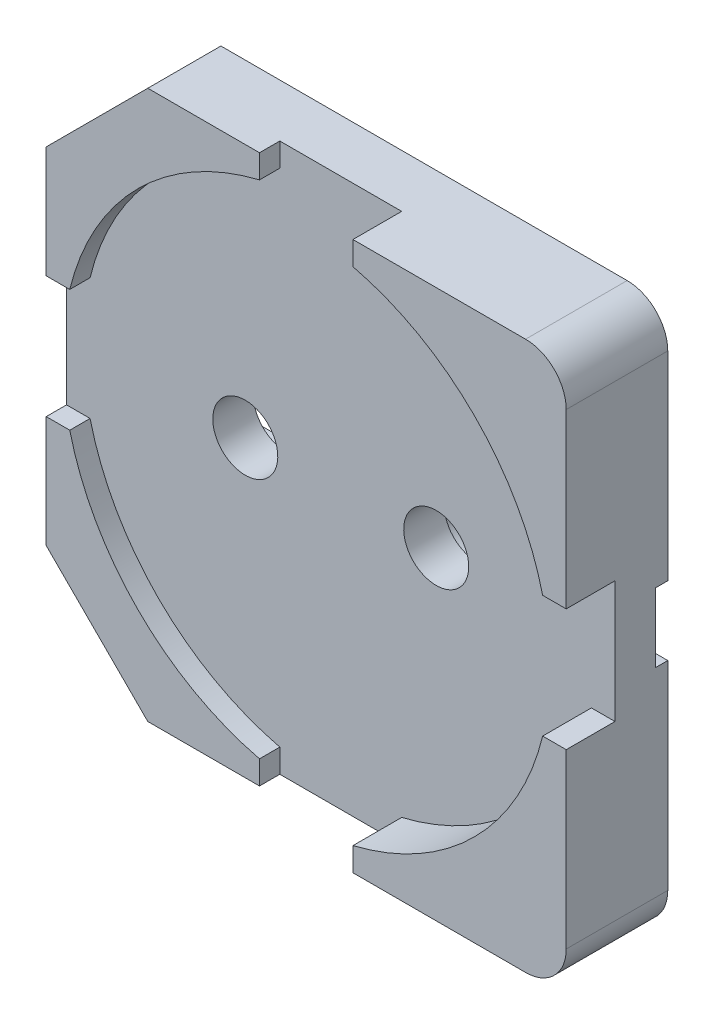
ISO-10303-21;
HEADER;
FILE_DESCRIPTION(('STEP AP214'),'2;1');
FILE_NAME('part.step','',(''),(''),'','','');
FILE_SCHEMA(('AUTOMOTIVE_DESIGN { 1 0 10303 214 1 1 1 1 }'));
ENDSEC;
DATA;
#1=APPLICATION_CONTEXT('core data for automotive mechanical design processes');
#2=APPLICATION_PROTOCOL_DEFINITION('international standard','automotive_design',2000,#1);
#3=PRODUCT_CONTEXT('',#1,'mechanical');
#4=PRODUCT('Part','Part','',(#3));
#5=PRODUCT_RELATED_PRODUCT_CATEGORY('part','',(#4));
#6=PRODUCT_DEFINITION_FORMATION('','',#4);
#7=PRODUCT_DEFINITION_CONTEXT('part definition',#1,'design');
#8=PRODUCT_DEFINITION('design','',#6,#7);
#9=PRODUCT_DEFINITION_SHAPE('','',#8);
#10=(LENGTH_UNIT() NAMED_UNIT(*) SI_UNIT(.MILLI.,.METRE.));
#11=(NAMED_UNIT(*) PLANE_ANGLE_UNIT() SI_UNIT($,.RADIAN.));
#12=(NAMED_UNIT(*) SI_UNIT($,.STERADIAN.) SOLID_ANGLE_UNIT());
#13=UNCERTAINTY_MEASURE_WITH_UNIT(LENGTH_MEASURE(1.E-05),#10,'distance_accuracy_value','');
#14=(GEOMETRIC_REPRESENTATION_CONTEXT(3) GLOBAL_UNCERTAINTY_ASSIGNED_CONTEXT((#13)) GLOBAL_UNIT_ASSIGNED_CONTEXT((#10,
#11,#12)) REPRESENTATION_CONTEXT('',''));
#15=CARTESIAN_POINT('',(0.,0.,0.));
#16=DIRECTION('',(0.,0.,1.));
#17=DIRECTION('',(1.,0.,0.));
#18=AXIS2_PLACEMENT_3D('',#15,#16,#17);
#19=CARTESIAN_POINT('',(0.,0.,0.));
#20=DIRECTION('',(0.,0.,-1.));
#21=DIRECTION('',(-1.,0.,0.));
#22=AXIS2_PLACEMENT_3D('',#19,#20,#21);
#23=PLANE('',#22);
#24=CARTESIAN_POINT('',(2.35,0.,0.));
#25=DIRECTION('',(0.,0.,1.));
#26=DIRECTION('',(0.,-1.,0.));
#27=AXIS2_PLACEMENT_3D('',#24,#25,#26);
#28=CIRCLE('',#27,0.85);
#29=CARTESIAN_POINT('',(2.35,0.85,0.));
#30=VERTEX_POINT('',#29);
#31=CARTESIAN_POINT('',(2.35,-0.85,0.));
#32=VERTEX_POINT('',#31);
#33=EDGE_CURVE('E28',#30,#32,#28,.T.);
#34=ORIENTED_EDGE('',*,*,#33,.T.);
#35=DIRECTION('',(1.,0.,0.));
#36=VECTOR('',#35,1.);
#37=CARTESIAN_POINT('',(0.,-0.85,0.));
#38=LINE('',#37,#36);
#39=CARTESIAN_POINT('',(6.75,-0.85,0.));
#40=VERTEX_POINT('',#39);
#41=EDGE_CURVE('E11',#32,#40,#38,.T.);
#42=ORIENTED_EDGE('',*,*,#41,.T.);
#43=DIRECTION('',(0.,-1.,0.));
#44=VECTOR('',#43,1.);
#45=CARTESIAN_POINT('',(6.75,0.,0.));
#46=LINE('',#45,#44);
#47=CARTESIAN_POINT('',(6.75,-5.75,0.));
#48=VERTEX_POINT('',#47);
#49=EDGE_CURVE('E358',#40,#48,#46,.T.);
#50=ORIENTED_EDGE('',*,*,#49,.T.);
#51=CARTESIAN_POINT('',(5.75,-5.75,0.));
#52=DIRECTION('',(0.,0.,1.));
#53=DIRECTION('',(0.,-1.,0.));
#54=AXIS2_PLACEMENT_3D('',#51,#52,#53);
#55=CIRCLE('',#54,1.);
#56=CARTESIAN_POINT('',(5.75,-6.75,0.));
#57=VERTEX_POINT('',#56);
#58=EDGE_CURVE('E393',#57,#48,#55,.T.);
#59=ORIENTED_EDGE('',*,*,#58,.F.);
#60=DIRECTION('',(-1.,0.,0.));
#61=VECTOR('',#60,1.);
#62=CARTESIAN_POINT('',(0.,-6.75,0.));
#63=LINE('',#62,#61);
#64=CARTESIAN_POINT('',(-4.25,-6.75,0.));
#65=VERTEX_POINT('',#64);
#66=EDGE_CURVE('E351',#57,#65,#63,.T.);
#67=ORIENTED_EDGE('',*,*,#66,.T.);
#68=DIRECTION('',(-0.707106781186548,0.707106781186548,0.));
#69=VECTOR('',#68,1.);
#70=CARTESIAN_POINT('',(-4.25,-6.75,0.));
#71=LINE('',#70,#69);
#72=CARTESIAN_POINT('',(-6.75,-4.25,0.));
#73=VERTEX_POINT('',#72);
#74=EDGE_CURVE('E357',#65,#73,#71,.T.);
#75=ORIENTED_EDGE('',*,*,#74,.T.);
#76=DIRECTION('',(0.,1.,0.));
#77=VECTOR('',#76,1.);
#78=CARTESIAN_POINT('',(-6.75,0.,0.));
#79=LINE('',#78,#77);
#80=CARTESIAN_POINT('',(-6.75,-0.85,0.));
#81=VERTEX_POINT('',#80);
#82=EDGE_CURVE('E386',#73,#81,#79,.T.);
#83=ORIENTED_EDGE('',*,*,#82,.T.);
#84=DIRECTION('',(1.,0.,0.));
#85=VECTOR('',#84,1.);
#86=CARTESIAN_POINT('',(0.,-0.85,0.));
#87=LINE('',#86,#85);
#88=CARTESIAN_POINT('',(-2.35,-0.85,0.));
#89=VERTEX_POINT('',#88);
#90=EDGE_CURVE('E356',#81,#89,#87,.T.);
#91=ORIENTED_EDGE('',*,*,#90,.T.);
#92=CARTESIAN_POINT('',(-2.35,0.,0.));
#93=DIRECTION('',(0.,0.,1.));
#94=DIRECTION('',(0.,-1.,0.));
#95=AXIS2_PLACEMENT_3D('',#92,#93,#94);
#96=CIRCLE('',#95,0.85);
#97=CARTESIAN_POINT('',(-2.35,0.85,0.));
#98=VERTEX_POINT('',#97);
#99=EDGE_CURVE('E385',#89,#98,#96,.T.);
#100=ORIENTED_EDGE('',*,*,#99,.T.);
#101=DIRECTION('',(-1.,0.,0.));
#102=VECTOR('',#101,1.);
#103=CARTESIAN_POINT('',(0.,0.85,0.));
#104=LINE('',#103,#102);
#105=CARTESIAN_POINT('',(-6.75,0.85,0.));
#106=VERTEX_POINT('',#105);
#107=EDGE_CURVE('E592',#98,#106,#104,.T.);
#108=ORIENTED_EDGE('',*,*,#107,.T.);
#109=DIRECTION('',(0.,1.,0.));
#110=VECTOR('',#109,1.);
#111=CARTESIAN_POINT('',(-6.75,0.,0.));
#112=LINE('',#111,#110);
#113=CARTESIAN_POINT('',(-6.75,4.25,0.));
#114=VERTEX_POINT('',#113);
#115=EDGE_CURVE('E389',#106,#114,#112,.T.);
#116=ORIENTED_EDGE('',*,*,#115,.T.);
#117=DIRECTION('',(0.707106781186548,0.707106781186548,0.));
#118=VECTOR('',#117,1.);
#119=CARTESIAN_POINT('',(-6.75,4.25,0.));
#120=LINE('',#119,#118);
#121=CARTESIAN_POINT('',(-4.25,6.75,0.));
#122=VERTEX_POINT('',#121);
#123=EDGE_CURVE('E432',#114,#122,#120,.T.);
#124=ORIENTED_EDGE('',*,*,#123,.T.);
#125=DIRECTION('',(1.,0.,0.));
#126=VECTOR('',#125,1.);
#127=CARTESIAN_POINT('',(0.,6.75,0.));
#128=LINE('',#127,#126);
#129=CARTESIAN_POINT('',(5.75,6.75,0.));
#130=VERTEX_POINT('',#129);
#131=EDGE_CURVE('E130',#122,#130,#128,.T.);
#132=ORIENTED_EDGE('',*,*,#131,.T.);
#133=CARTESIAN_POINT('',(5.75,5.75,0.));
#134=DIRECTION('',(0.,0.,1.));
#135=DIRECTION('',(0.,-1.,0.));
#136=AXIS2_PLACEMENT_3D('',#133,#134,#135);
#137=CIRCLE('',#136,1.);
#138=CARTESIAN_POINT('',(6.75,5.75,0.));
#139=VERTEX_POINT('',#138);
#140=EDGE_CURVE('E501',#139,#130,#137,.T.);
#141=ORIENTED_EDGE('',*,*,#140,.F.);
#142=DIRECTION('',(0.,-1.,0.));
#143=VECTOR('',#142,1.);
#144=CARTESIAN_POINT('',(6.75,0.,0.));
#145=LINE('',#144,#143);
#146=CARTESIAN_POINT('',(6.75,0.85,0.));
#147=VERTEX_POINT('',#146);
#148=EDGE_CURVE('E497',#139,#147,#145,.T.);
#149=ORIENTED_EDGE('',*,*,#148,.T.);
#150=DIRECTION('',(-1.,0.,0.));
#151=VECTOR('',#150,1.);
#152=CARTESIAN_POINT('',(0.,0.85,0.));
#153=LINE('',#152,#151);
#154=EDGE_CURVE('E507',#147,#30,#153,.T.);
#155=ORIENTED_EDGE('',*,*,#154,.T.);
#156=EDGE_LOOP('',(#34,#42,#50,#59,#67,#75,#83,#91,#100,#108,#116,#124,#132,#141,#149,#155));
#157=FACE_BOUND('',#156,.T.);
#158=ADVANCED_FACE('F17',(#157),#23,.T.);
#159=CARTESIAN_POINT('',(6.75,-0.85,0.3));
#160=DIRECTION('',(0.,-1.,0.));
#161=DIRECTION('',(0.,0.,-1.));
#162=AXIS2_PLACEMENT_3D('',#159,#160,#161);
#163=PLANE('',#162);
#164=DIRECTION('',(0.,0.,-1.));
#165=VECTOR('',#164,1.);
#166=CARTESIAN_POINT('',(2.35,-0.85,0.3));
#167=LINE('',#166,#165);
#168=CARTESIAN_POINT('',(2.35,-0.85,0.3));
#169=VERTEX_POINT('',#168);
#170=EDGE_CURVE('E396',#169,#32,#167,.T.);
#171=ORIENTED_EDGE('',*,*,#170,.F.);
#172=DIRECTION('',(-1.,0.,0.));
#173=VECTOR('',#172,1.);
#174=CARTESIAN_POINT('',(6.75,-0.85,0.3));
#175=LINE('',#174,#173);
#176=CARTESIAN_POINT('',(6.75,-0.85,0.3));
#177=VERTEX_POINT('',#176);
#178=EDGE_CURVE('E536',#177,#169,#175,.T.);
#179=ORIENTED_EDGE('',*,*,#178,.F.);
#180=DIRECTION('',(0.,0.,1.));
#181=VECTOR('',#180,1.);
#182=CARTESIAN_POINT('',(6.75,-0.85,0.3));
#183=LINE('',#182,#181);
#184=EDGE_CURVE('E360',#40,#177,#183,.T.);
#185=ORIENTED_EDGE('',*,*,#184,.F.);
#186=ORIENTED_EDGE('',*,*,#41,.F.);
#187=EDGE_LOOP('',(#171,#179,#185,#186));
#188=FACE_BOUND('',#187,.T.);
#189=ADVANCED_FACE('F784',(#188),#163,.F.);
#190=CARTESIAN_POINT('',(2.35,0.,0.3));
#191=DIRECTION('',(0.,0.,-1.));
#192=DIRECTION('',(0.,-1.,0.));
#193=AXIS2_PLACEMENT_3D('',#190,#191,#192);
#194=CYLINDRICAL_SURFACE('',#193,0.85);
#195=DIRECTION('',(0.,0.,-1.));
#196=VECTOR('',#195,1.);
#197=CARTESIAN_POINT('',(2.35,0.85,0.3));
#198=LINE('',#197,#196);
#199=CARTESIAN_POINT('',(2.35,0.85,0.3));
#200=VERTEX_POINT('',#199);
#201=EDGE_CURVE('E513',#200,#30,#198,.T.);
#202=ORIENTED_EDGE('',*,*,#201,.F.);
#203=CARTESIAN_POINT('',(2.35,0.,0.3));
#204=DIRECTION('',(0.,0.,-1.));
#205=DIRECTION('',(0.,-1.,0.));
#206=AXIS2_PLACEMENT_3D('',#203,#204,#205);
#207=CIRCLE('',#206,0.85);
#208=EDGE_CURVE('E323',#169,#200,#207,.T.);
#209=ORIENTED_EDGE('',*,*,#208,.F.);
#210=ORIENTED_EDGE('',*,*,#170,.T.);
#211=ORIENTED_EDGE('',*,*,#33,.F.);
#212=EDGE_LOOP('',(#202,#209,#210,#211));
#213=FACE_BOUND('',#212,.T.);
#214=ADVANCED_FACE('F790',(#213),#194,.F.);
#215=CARTESIAN_POINT('',(6.75,0.85,0.3));
#216=DIRECTION('',(0.,1.,0.));
#217=DIRECTION('',(1.,0.,0.));
#218=AXIS2_PLACEMENT_3D('',#215,#216,#217);
#219=PLANE('',#218);
#220=DIRECTION('',(0.,0.,-1.));
#221=VECTOR('',#220,1.);
#222=CARTESIAN_POINT('',(6.75,0.85,0.3));
#223=LINE('',#222,#221);
#224=CARTESIAN_POINT('',(6.75,0.85,0.3));
#225=VERTEX_POINT('',#224);
#226=EDGE_CURVE('E493',#225,#147,#223,.T.);
#227=ORIENTED_EDGE('',*,*,#226,.F.);
#228=DIRECTION('',(1.,0.,0.));
#229=VECTOR('',#228,1.);
#230=CARTESIAN_POINT('',(6.75,0.85,0.3));
#231=LINE('',#230,#229);
#232=EDGE_CURVE('E588',#200,#225,#231,.T.);
#233=ORIENTED_EDGE('',*,*,#232,.F.);
#234=ORIENTED_EDGE('',*,*,#201,.T.);
#235=ORIENTED_EDGE('',*,*,#154,.F.);
#236=EDGE_LOOP('',(#227,#233,#234,#235));
#237=FACE_BOUND('',#236,.T.);
#238=ADVANCED_FACE('F754',(#237),#219,.F.);
#239=CARTESIAN_POINT('',(6.75,6.75,1.3));
#240=DIRECTION('',(-1.,0.,0.));
#241=DIRECTION('',(0.,1.,0.));
#242=AXIS2_PLACEMENT_3D('',#239,#240,#241);
#243=PLANE('',#242);
#244=DIRECTION('',(0.,0.,1.));
#245=VECTOR('',#244,1.);
#246=CARTESIAN_POINT('',(6.75,-5.75,1.3));
#247=LINE('',#246,#245);
#248=CARTESIAN_POINT('',(6.75,-5.75,2.5));
#249=VERTEX_POINT('',#248);
#250=EDGE_CURVE('E390',#48,#249,#247,.T.);
#251=ORIENTED_EDGE('',*,*,#250,.F.);
#252=ORIENTED_EDGE('',*,*,#49,.F.);
#253=ORIENTED_EDGE('',*,*,#184,.T.);
#254=DIRECTION('',(0.,-1.,0.));
#255=VECTOR('',#254,1.);
#256=CARTESIAN_POINT('',(6.75,6.75,0.3));
#257=LINE('',#256,#255);
#258=EDGE_CURVE('E544',#225,#177,#257,.T.);
#259=ORIENTED_EDGE('',*,*,#258,.F.);
#260=ORIENTED_EDGE('',*,*,#226,.T.);
#261=ORIENTED_EDGE('',*,*,#148,.F.);
#262=DIRECTION('',(0.,0.,-1.));
#263=VECTOR('',#262,1.);
#264=CARTESIAN_POINT('',(6.75,5.75,1.3));
#265=LINE('',#264,#263);
#266=CARTESIAN_POINT('',(6.75,5.75,2.5));
#267=VERTEX_POINT('',#266);
#268=EDGE_CURVE('E468',#267,#139,#265,.T.);
#269=ORIENTED_EDGE('',*,*,#268,.F.);
#270=DIRECTION('',(0.,1.,0.));
#271=VECTOR('',#270,1.);
#272=CARTESIAN_POINT('',(6.75,6.75,2.5));
#273=LINE('',#272,#271);
#274=CARTESIAN_POINT('',(6.75,1.5,2.5));
#275=VERTEX_POINT('',#274);
#276=EDGE_CURVE('E409',#275,#267,#273,.T.);
#277=ORIENTED_EDGE('',*,*,#276,.F.);
#278=DIRECTION('',(0.,0.,1.));
#279=VECTOR('',#278,1.);
#280=CARTESIAN_POINT('',(6.75,1.5,1.3));
#281=LINE('',#280,#279);
#282=CARTESIAN_POINT('',(6.75,1.5,1.3));
#283=VERTEX_POINT('',#282);
#284=EDGE_CURVE('E551',#283,#275,#281,.T.);
#285=ORIENTED_EDGE('',*,*,#284,.F.);
#286=DIRECTION('',(0.,1.,0.));
#287=VECTOR('',#286,1.);
#288=CARTESIAN_POINT('',(6.75,6.75,1.3));
#289=LINE('',#288,#287);
#290=CARTESIAN_POINT('',(6.75,-1.5,1.3));
#291=VERTEX_POINT('',#290);
#292=EDGE_CURVE('E330',#291,#283,#289,.T.);
#293=ORIENTED_EDGE('',*,*,#292,.F.);
#294=DIRECTION('',(0.,0.,-1.));
#295=VECTOR('',#294,1.);
#296=CARTESIAN_POINT('',(6.75,-1.5,1.3));
#297=LINE('',#296,#295);
#298=CARTESIAN_POINT('',(6.75,-1.5,2.5));
#299=VERTEX_POINT('',#298);
#300=EDGE_CURVE('E327',#299,#291,#297,.T.);
#301=ORIENTED_EDGE('',*,*,#300,.F.);
#302=DIRECTION('',(0.,1.,0.));
#303=VECTOR('',#302,1.);
#304=CARTESIAN_POINT('',(6.75,6.75,2.5));
#305=LINE('',#304,#303);
#306=EDGE_CURVE('E311',#249,#299,#305,.T.);
#307=ORIENTED_EDGE('',*,*,#306,.F.);
#308=EDGE_LOOP('',(#251,#252,#253,#259,#260,#261,#269,#277,#285,#293,#301,#307));
#309=FACE_BOUND('',#308,.T.);
#310=ADVANCED_FACE('F328',(#309),#243,.F.);
#311=CARTESIAN_POINT('',(6.75,6.75,1.3));
#312=DIRECTION('',(0.,-1.,0.));
#313=DIRECTION('',(0.,0.,-1.));
#314=AXIS2_PLACEMENT_3D('',#311,#312,#313);
#315=PLANE('',#314);
#316=DIRECTION('',(0.,0.,1.));
#317=VECTOR('',#316,1.);
#318=CARTESIAN_POINT('',(5.75,6.75,1.3));
#319=LINE('',#318,#317);
#320=CARTESIAN_POINT('',(5.75,6.75,2.5));
#321=VERTEX_POINT('',#320);
#322=EDGE_CURVE('E472',#130,#321,#319,.T.);
#323=ORIENTED_EDGE('',*,*,#322,.F.);
#324=ORIENTED_EDGE('',*,*,#131,.F.);
#325=DIRECTION('',(0.,0.,-1.));
#326=VECTOR('',#325,1.);
#327=CARTESIAN_POINT('',(-4.25,6.75,1.3));
#328=LINE('',#327,#326);
#329=CARTESIAN_POINT('',(-4.25,6.75,1.8));
#330=VERTEX_POINT('',#329);
#331=EDGE_CURVE('E388',#330,#122,#328,.T.);
#332=ORIENTED_EDGE('',*,*,#331,.F.);
#333=DIRECTION('',(-1.,0.,0.));
#334=VECTOR('',#333,1.);
#335=CARTESIAN_POINT('',(6.75,6.75,1.8));
#336=LINE('',#335,#334);
#337=CARTESIAN_POINT('',(-1.5,6.75,1.8));
#338=VERTEX_POINT('',#337);
#339=EDGE_CURVE('E347',#338,#330,#336,.T.);
#340=ORIENTED_EDGE('',*,*,#339,.F.);
#341=DIRECTION('',(0.,0.,1.));
#342=VECTOR('',#341,1.);
#343=CARTESIAN_POINT('',(-1.5,6.75,1.3));
#344=LINE('',#343,#342);
#345=CARTESIAN_POINT('',(-1.5,6.75,1.3));
#346=VERTEX_POINT('',#345);
#347=EDGE_CURVE('E558',#346,#338,#344,.T.);
#348=ORIENTED_EDGE('',*,*,#347,.F.);
#349=DIRECTION('',(-1.,0.,0.));
#350=VECTOR('',#349,1.);
#351=CARTESIAN_POINT('',(6.75,6.75,1.3));
#352=LINE('',#351,#350);
#353=CARTESIAN_POINT('',(1.5,6.75,1.3));
#354=VERTEX_POINT('',#353);
#355=EDGE_CURVE('E512',#354,#346,#352,.T.);
#356=ORIENTED_EDGE('',*,*,#355,.F.);
#357=DIRECTION('',(0.,0.,-1.));
#358=VECTOR('',#357,1.);
#359=CARTESIAN_POINT('',(1.5,6.75,1.3));
#360=LINE('',#359,#358);
#361=CARTESIAN_POINT('',(1.5,6.75,2.5));
#362=VERTEX_POINT('',#361);
#363=EDGE_CURVE('E433',#362,#354,#360,.T.);
#364=ORIENTED_EDGE('',*,*,#363,.F.);
#365=DIRECTION('',(-1.,0.,0.));
#366=VECTOR('',#365,1.);
#367=CARTESIAN_POINT('',(6.75,6.75,2.5));
#368=LINE('',#367,#366);
#369=EDGE_CURVE('E498',#321,#362,#368,.T.);
#370=ORIENTED_EDGE('',*,*,#369,.F.);
#371=EDGE_LOOP('',(#323,#324,#332,#340,#348,#356,#364,#370));
#372=FACE_BOUND('',#371,.T.);
#373=ADVANCED_FACE('F721',(#372),#315,.F.);
#374=CARTESIAN_POINT('',(-6.75,4.25,1.3));
#375=DIRECTION('',(0.707106781186548,-0.707106781186548,0.));
#376=DIRECTION('',(0.,0.,-1.));
#377=AXIS2_PLACEMENT_3D('',#374,#375,#376);
#378=PLANE('',#377);
#379=ORIENTED_EDGE('',*,*,#331,.T.);
#380=ORIENTED_EDGE('',*,*,#123,.F.);
#381=DIRECTION('',(0.,0.,-1.));
#382=VECTOR('',#381,1.);
#383=CARTESIAN_POINT('',(-6.75,4.25,1.3));
#384=LINE('',#383,#382);
#385=CARTESIAN_POINT('',(-6.75,4.25,1.8));
#386=VERTEX_POINT('',#385);
#387=EDGE_CURVE('E455',#386,#114,#384,.T.);
#388=ORIENTED_EDGE('',*,*,#387,.F.);
#389=DIRECTION('',(-0.707106781186548,-0.707106781186548,0.));
#390=VECTOR('',#389,1.);
#391=CARTESIAN_POINT('',(-6.75,4.25,1.8));
#392=LINE('',#391,#390);
#393=EDGE_CURVE('E476',#330,#386,#392,.T.);
#394=ORIENTED_EDGE('',*,*,#393,.F.);
#395=EDGE_LOOP('',(#379,#380,#388,#394));
#396=FACE_BOUND('',#395,.T.);
#397=ADVANCED_FACE('F19',(#396),#378,.F.);
#398=CARTESIAN_POINT('',(-6.75,6.75,1.3));
#399=DIRECTION('',(1.,0.,0.));
#400=DIRECTION('',(0.,1.,0.));
#401=AXIS2_PLACEMENT_3D('',#398,#399,#400);
#402=PLANE('',#401);
#403=DIRECTION('',(0.,0.,-1.));
#404=VECTOR('',#403,1.);
#405=CARTESIAN_POINT('',(-6.75,-4.25,1.3));
#406=LINE('',#405,#404);
#407=CARTESIAN_POINT('',(-6.75,-4.25,1.8));
#408=VERTEX_POINT('',#407);
#409=EDGE_CURVE('E523',#408,#73,#406,.T.);
#410=ORIENTED_EDGE('',*,*,#409,.F.);
#411=DIRECTION('',(0.,-1.,0.));
#412=VECTOR('',#411,1.);
#413=CARTESIAN_POINT('',(-6.75,6.75,1.8));
#414=LINE('',#413,#412);
#415=CARTESIAN_POINT('',(-6.75,-1.5,1.8));
#416=VERTEX_POINT('',#415);
#417=EDGE_CURVE('E421',#416,#408,#414,.T.);
#418=ORIENTED_EDGE('',*,*,#417,.F.);
#419=DIRECTION('',(0.,0.,1.));
#420=VECTOR('',#419,1.);
#421=CARTESIAN_POINT('',(-6.75,-1.5,1.3));
#422=LINE('',#421,#420);
#423=CARTESIAN_POINT('',(-6.75,-1.5,1.3));
#424=VERTEX_POINT('',#423);
#425=EDGE_CURVE('E429',#424,#416,#422,.T.);
#426=ORIENTED_EDGE('',*,*,#425,.F.);
#427=DIRECTION('',(0.,-1.,0.));
#428=VECTOR('',#427,1.);
#429=CARTESIAN_POINT('',(-6.75,6.75,1.3));
#430=LINE('',#429,#428);
#431=CARTESIAN_POINT('',(-6.75,1.5,1.3));
#432=VERTEX_POINT('',#431);
#433=EDGE_CURVE('E334',#432,#424,#430,.T.);
#434=ORIENTED_EDGE('',*,*,#433,.F.);
#435=DIRECTION('',(0.,0.,-1.));
#436=VECTOR('',#435,1.);
#437=CARTESIAN_POINT('',(-6.75,1.5,1.3));
#438=LINE('',#437,#436);
#439=CARTESIAN_POINT('',(-6.75,1.5,1.8));
#440=VERTEX_POINT('',#439);
#441=EDGE_CURVE('E403',#440,#432,#438,.T.);
#442=ORIENTED_EDGE('',*,*,#441,.F.);
#443=DIRECTION('',(0.,-1.,0.));
#444=VECTOR('',#443,1.);
#445=CARTESIAN_POINT('',(-6.75,6.75,1.8));
#446=LINE('',#445,#444);
#447=EDGE_CURVE('E473',#386,#440,#446,.T.);
#448=ORIENTED_EDGE('',*,*,#447,.F.);
#449=ORIENTED_EDGE('',*,*,#387,.T.);
#450=ORIENTED_EDGE('',*,*,#115,.F.);
#451=DIRECTION('',(0.,0.,-1.));
#452=VECTOR('',#451,1.);
#453=CARTESIAN_POINT('',(-6.75,0.85,1.3));
#454=LINE('',#453,#452);
#455=CARTESIAN_POINT('',(-6.75,0.85,0.3));
#456=VERTEX_POINT('',#455);
#457=EDGE_CURVE('E605',#456,#106,#454,.T.);
#458=ORIENTED_EDGE('',*,*,#457,.F.);
#459=DIRECTION('',(0.,1.,0.));
#460=VECTOR('',#459,1.);
#461=CARTESIAN_POINT('',(-6.75,0.,0.3));
#462=LINE('',#461,#460);
#463=CARTESIAN_POINT('',(-6.75,-0.85,0.3));
#464=VERTEX_POINT('',#463);
#465=EDGE_CURVE('E373',#464,#456,#462,.T.);
#466=ORIENTED_EDGE('',*,*,#465,.F.);
#467=DIRECTION('',(0.,0.,1.));
#468=VECTOR('',#467,1.);
#469=CARTESIAN_POINT('',(-6.75,-0.85,1.3));
#470=LINE('',#469,#468);
#471=EDGE_CURVE('E438',#81,#464,#470,.T.);
#472=ORIENTED_EDGE('',*,*,#471,.F.);
#473=ORIENTED_EDGE('',*,*,#82,.F.);
#474=EDGE_LOOP('',(#410,#418,#426,#434,#442,#448,#449,#450,#458,#466,#472,#473));
#475=FACE_BOUND('',#474,.T.);
#476=ADVANCED_FACE('F716',(#475),#402,.F.);
#477=CARTESIAN_POINT('',(-6.75,0.85,0.3));
#478=DIRECTION('',(0.,-1.,0.));
#479=DIRECTION('',(0.,0.,-1.));
#480=AXIS2_PLACEMENT_3D('',#477,#478,#479);
#481=PLANE('',#480);
#482=DIRECTION('',(-1.,0.,0.));
#483=VECTOR('',#482,1.);
#484=CARTESIAN_POINT('',(-6.75,0.85,0.3));
#485=LINE('',#484,#483);
#486=CARTESIAN_POINT('',(-2.35,0.85,0.3));
#487=VERTEX_POINT('',#486);
#488=EDGE_CURVE('E480',#487,#456,#485,.T.);
#489=ORIENTED_EDGE('',*,*,#488,.T.);
#490=ORIENTED_EDGE('',*,*,#457,.T.);
#491=ORIENTED_EDGE('',*,*,#107,.F.);
#492=DIRECTION('',(0.,0.,1.));
#493=VECTOR('',#492,1.);
#494=CARTESIAN_POINT('',(-2.35,0.85,0.3));
#495=LINE('',#494,#493);
#496=EDGE_CURVE('E441',#98,#487,#495,.T.);
#497=ORIENTED_EDGE('',*,*,#496,.T.);
#498=EDGE_LOOP('',(#489,#490,#491,#497));
#499=FACE_BOUND('',#498,.T.);
#500=ADVANCED_FACE('F710',(#499),#481,.T.);
#501=CARTESIAN_POINT('',(-2.35,0.,0.3));
#502=DIRECTION('',(0.,0.,-1.));
#503=DIRECTION('',(0.,-1.,0.));
#504=AXIS2_PLACEMENT_3D('',#501,#502,#503);
#505=CYLINDRICAL_SURFACE('',#504,0.85);
#506=DIRECTION('',(0.,0.,-1.));
#507=VECTOR('',#506,1.);
#508=CARTESIAN_POINT('',(-2.35,-0.85,0.3));
#509=LINE('',#508,#507);
#510=CARTESIAN_POINT('',(-2.35,-0.85,0.3));
#511=VERTEX_POINT('',#510);
#512=EDGE_CURVE('E353',#511,#89,#509,.T.);
#513=ORIENTED_EDGE('',*,*,#512,.F.);
#514=CARTESIAN_POINT('',(-2.35,0.,0.3));
#515=DIRECTION('',(0.,0.,-1.));
#516=DIRECTION('',(0.,-1.,0.));
#517=AXIS2_PLACEMENT_3D('',#514,#515,#516);
#518=CIRCLE('',#517,0.85);
#519=EDGE_CURVE('E361',#487,#511,#518,.T.);
#520=ORIENTED_EDGE('',*,*,#519,.F.);
#521=ORIENTED_EDGE('',*,*,#496,.F.);
#522=ORIENTED_EDGE('',*,*,#99,.F.);
#523=EDGE_LOOP('',(#513,#520,#521,#522));
#524=FACE_BOUND('',#523,.T.);
#525=ADVANCED_FACE('F709',(#524),#505,.F.);
#526=CARTESIAN_POINT('',(-6.75,-0.85,0.3));
#527=DIRECTION('',(0.,1.,0.));
#528=DIRECTION('',(1.,0.,0.));
#529=AXIS2_PLACEMENT_3D('',#526,#527,#528);
#530=PLANE('',#529);
#531=DIRECTION('',(1.,0.,0.));
#532=VECTOR('',#531,1.);
#533=CARTESIAN_POINT('',(-6.75,-0.85,0.3));
#534=LINE('',#533,#532);
#535=EDGE_CURVE('E364',#464,#511,#534,.T.);
#536=ORIENTED_EDGE('',*,*,#535,.T.);
#537=ORIENTED_EDGE('',*,*,#512,.T.);
#538=ORIENTED_EDGE('',*,*,#90,.F.);
#539=ORIENTED_EDGE('',*,*,#471,.T.);
#540=EDGE_LOOP('',(#536,#537,#538,#539));
#541=FACE_BOUND('',#540,.T.);
#542=ADVANCED_FACE('F799',(#541),#530,.T.);
#543=CARTESIAN_POINT('',(-4.25,-6.75,1.3));
#544=DIRECTION('',(0.707106781186548,0.707106781186548,0.));
#545=DIRECTION('',(0.,0.,-1.));
#546=AXIS2_PLACEMENT_3D('',#543,#544,#545);
#547=PLANE('',#546);
#548=ORIENTED_EDGE('',*,*,#409,.T.);
#549=ORIENTED_EDGE('',*,*,#74,.F.);
#550=DIRECTION('',(0.,0.,-1.));
#551=VECTOR('',#550,1.);
#552=CARTESIAN_POINT('',(-4.25,-6.75,1.3));
#553=LINE('',#552,#551);
#554=CARTESIAN_POINT('',(-4.25,-6.75,1.8));
#555=VERTEX_POINT('',#554);
#556=EDGE_CURVE('E543',#555,#65,#553,.T.);
#557=ORIENTED_EDGE('',*,*,#556,.F.);
#558=DIRECTION('',(0.707106781186548,-0.707106781186548,0.));
#559=VECTOR('',#558,1.);
#560=CARTESIAN_POINT('',(-4.25,-6.75,1.8));
#561=LINE('',#560,#559);
#562=EDGE_CURVE('E415',#408,#555,#561,.T.);
#563=ORIENTED_EDGE('',*,*,#562,.F.);
#564=EDGE_LOOP('',(#548,#549,#557,#563));
#565=FACE_BOUND('',#564,.T.);
#566=ADVANCED_FACE('F835',(#565),#547,.F.);
#567=CARTESIAN_POINT('',(6.75,-6.75,1.3));
#568=DIRECTION('',(0.,1.,0.));
#569=DIRECTION('',(1.,0.,0.));
#570=AXIS2_PLACEMENT_3D('',#567,#568,#569);
#571=PLANE('',#570);
#572=DIRECTION('',(0.,0.,-1.));
#573=VECTOR('',#572,1.);
#574=CARTESIAN_POINT('',(5.75,-6.75,1.3));
#575=LINE('',#574,#573);
#576=CARTESIAN_POINT('',(5.75,-6.75,2.5));
#577=VERTEX_POINT('',#576);
#578=EDGE_CURVE('E448',#577,#57,#575,.T.);
#579=ORIENTED_EDGE('',*,*,#578,.F.);
#580=DIRECTION('',(1.,0.,0.));
#581=VECTOR('',#580,1.);
#582=CARTESIAN_POINT('',(6.75,-6.75,2.5));
#583=LINE('',#582,#581);
#584=CARTESIAN_POINT('',(1.5,-6.75,2.5));
#585=VERTEX_POINT('',#584);
#586=EDGE_CURVE('E324',#585,#577,#583,.T.);
#587=ORIENTED_EDGE('',*,*,#586,.F.);
#588=DIRECTION('',(0.,0.,1.));
#589=VECTOR('',#588,1.);
#590=CARTESIAN_POINT('',(1.5,-6.75,1.3));
#591=LINE('',#590,#589);
#592=CARTESIAN_POINT('',(1.5,-6.75,1.3));
#593=VERTEX_POINT('',#592);
#594=EDGE_CURVE('E376',#593,#585,#591,.T.);
#595=ORIENTED_EDGE('',*,*,#594,.F.);
#596=DIRECTION('',(1.,0.,0.));
#597=VECTOR('',#596,1.);
#598=CARTESIAN_POINT('',(6.75,-6.75,1.3));
#599=LINE('',#598,#597);
#600=CARTESIAN_POINT('',(-1.5,-6.75,1.3));
#601=VERTEX_POINT('',#600);
#602=EDGE_CURVE('E595',#601,#593,#599,.T.);
#603=ORIENTED_EDGE('',*,*,#602,.F.);
#604=DIRECTION('',(0.,0.,-1.));
#605=VECTOR('',#604,1.);
#606=CARTESIAN_POINT('',(-1.5,-6.75,1.3));
#607=LINE('',#606,#605);
#608=CARTESIAN_POINT('',(-1.5,-6.75,1.8));
#609=VERTEX_POINT('',#608);
#610=EDGE_CURVE('E489',#609,#601,#607,.T.);
#611=ORIENTED_EDGE('',*,*,#610,.F.);
#612=DIRECTION('',(1.,0.,0.));
#613=VECTOR('',#612,1.);
#614=CARTESIAN_POINT('',(6.75,-6.75,1.8));
#615=LINE('',#614,#613);
#616=EDGE_CURVE('E418',#555,#609,#615,.T.);
#617=ORIENTED_EDGE('',*,*,#616,.F.);
#618=ORIENTED_EDGE('',*,*,#556,.T.);
#619=ORIENTED_EDGE('',*,*,#66,.F.);
#620=EDGE_LOOP('',(#579,#587,#595,#603,#611,#617,#618,#619));
#621=FACE_BOUND('',#620,.T.);
#622=ADVANCED_FACE('F832',(#621),#571,.F.);
#623=CARTESIAN_POINT('',(2.35,0.,0.3));
#624=DIRECTION('',(0.,0.,-1.));
#625=DIRECTION('',(-1.,0.,0.));
#626=AXIS2_PLACEMENT_3D('',#623,#624,#625);
#627=PLANE('',#626);
#628=ORIENTED_EDGE('',*,*,#208,.T.);
#629=ORIENTED_EDGE('',*,*,#232,.T.);
#630=ORIENTED_EDGE('',*,*,#258,.T.);
#631=ORIENTED_EDGE('',*,*,#178,.T.);
#632=EDGE_LOOP('',(#628,#629,#630,#631));
#633=FACE_BOUND('',#632,.T.);
#634=CARTESIAN_POINT('',(2.35,0.,0.3));
#635=DIRECTION('',(0.,0.,1.));
#636=DIRECTION('',(0.,1.,0.));
#637=AXIS2_PLACEMENT_3D('',#634,#635,#636);
#638=CIRCLE('',#637,0.8);
#639=CARTESIAN_POINT('',(2.35,0.8,0.3));
#640=VERTEX_POINT('',#639);
#641=EDGE_CURVE('E461',#640,#640,#638,.T.);
#642=ORIENTED_EDGE('',*,*,#641,.T.);
#643=EDGE_LOOP('',(#642));
#644=FACE_BOUND('',#643,.T.);
#645=ADVANCED_FACE('F831',(#633,#644),#627,.T.);
#646=CARTESIAN_POINT('',(0.,0.,2.5));
#647=DIRECTION('',(0.,0.,1.));
#648=DIRECTION('',(0.,-1.,0.));
#649=AXIS2_PLACEMENT_3D('',#646,#647,#648);
#650=PLANE('',#649);
#651=CARTESIAN_POINT('',(0.,0.,2.5));
#652=DIRECTION('',(0.,0.,-1.));
#653=DIRECTION('',(0.,-1.,0.));
#654=AXIS2_PLACEMENT_3D('',#651,#652,#653);
#655=CIRCLE('',#654,6.35);
#656=CARTESIAN_POINT('',(6.170291727301,-1.5,2.5));
#657=VERTEX_POINT('',#656);
#658=CARTESIAN_POINT('',(1.5,-6.170291727301,2.5));
#659=VERTEX_POINT('',#658);
#660=EDGE_CURVE('E535',#657,#659,#655,.T.);
#661=ORIENTED_EDGE('',*,*,#660,.T.);
#662=DIRECTION('',(0.,-1.,0.));
#663=VECTOR('',#662,1.);
#664=CARTESIAN_POINT('',(1.5,0.,2.5));
#665=LINE('',#664,#663);
#666=EDGE_CURVE('E234',#659,#585,#665,.T.);
#667=ORIENTED_EDGE('',*,*,#666,.T.);
#668=ORIENTED_EDGE('',*,*,#586,.T.);
#669=CARTESIAN_POINT('',(5.75,-5.75,2.5));
#670=DIRECTION('',(0.,0.,1.));
#671=DIRECTION('',(0.,-1.,0.));
#672=AXIS2_PLACEMENT_3D('',#669,#670,#671);
#673=CIRCLE('',#672,1.);
#674=EDGE_CURVE('E318',#577,#249,#673,.T.);
#675=ORIENTED_EDGE('',*,*,#674,.T.);
#676=ORIENTED_EDGE('',*,*,#306,.T.);
#677=DIRECTION('',(-1.,0.,0.));
#678=VECTOR('',#677,1.);
#679=CARTESIAN_POINT('',(0.,-1.5,2.5));
#680=LINE('',#679,#678);
#681=EDGE_CURVE('E315',#299,#657,#680,.T.);
#682=ORIENTED_EDGE('',*,*,#681,.T.);
#683=EDGE_LOOP('',(#661,#667,#668,#675,#676,#682));
#684=FACE_BOUND('',#683,.T.);
#685=ADVANCED_FACE('F313',(#684),#650,.T.);
#686=CARTESIAN_POINT('',(5.75,-5.75,1.3));
#687=DIRECTION('',(0.,0.,-1.));
#688=DIRECTION('',(0.,-1.,0.));
#689=AXIS2_PLACEMENT_3D('',#686,#687,#688);
#690=CYLINDRICAL_SURFACE('',#689,1.);
#691=ORIENTED_EDGE('',*,*,#58,.T.);
#692=ORIENTED_EDGE('',*,*,#250,.T.);
#693=ORIENTED_EDGE('',*,*,#674,.F.);
#694=ORIENTED_EDGE('',*,*,#578,.T.);
#695=EDGE_LOOP('',(#691,#692,#693,#694));
#696=FACE_BOUND('',#695,.T.);
#697=ADVANCED_FACE('F830',(#696),#690,.T.);
#698=CARTESIAN_POINT('',(5.75,5.75,1.3));
#699=DIRECTION('',(0.,0.,-1.));
#700=DIRECTION('',(0.,-1.,0.));
#701=AXIS2_PLACEMENT_3D('',#698,#699,#700);
#702=CYLINDRICAL_SURFACE('',#701,1.);
#703=ORIENTED_EDGE('',*,*,#140,.T.);
#704=ORIENTED_EDGE('',*,*,#322,.T.);
#705=CARTESIAN_POINT('',(5.75,5.75,2.5));
#706=DIRECTION('',(0.,0.,-1.));
#707=DIRECTION('',(0.,-1.,0.));
#708=AXIS2_PLACEMENT_3D('',#705,#706,#707);
#709=CIRCLE('',#708,1.);
#710=EDGE_CURVE('E413',#321,#267,#709,.T.);
#711=ORIENTED_EDGE('',*,*,#710,.T.);
#712=ORIENTED_EDGE('',*,*,#268,.T.);
#713=EDGE_LOOP('',(#703,#704,#711,#712));
#714=FACE_BOUND('',#713,.T.);
#715=ADVANCED_FACE('F748',(#714),#702,.T.);
#716=CARTESIAN_POINT('',(0.,0.,2.5));
#717=DIRECTION('',(0.,0.,1.));
#718=DIRECTION('',(0.,-1.,0.));
#719=AXIS2_PLACEMENT_3D('',#716,#717,#718);
#720=PLANE('',#719);
#721=CARTESIAN_POINT('',(0.,0.,2.5));
#722=DIRECTION('',(0.,0.,-1.));
#723=DIRECTION('',(0.,-1.,0.));
#724=AXIS2_PLACEMENT_3D('',#721,#722,#723);
#725=CIRCLE('',#724,6.35);
#726=CARTESIAN_POINT('',(1.5,6.170291727301,2.5));
#727=VERTEX_POINT('',#726);
#728=CARTESIAN_POINT('',(6.170291727301,1.5,2.5));
#729=VERTEX_POINT('',#728);
#730=EDGE_CURVE('E402',#727,#729,#725,.T.);
#731=ORIENTED_EDGE('',*,*,#730,.T.);
#732=DIRECTION('',(1.,0.,0.));
#733=VECTOR('',#732,1.);
#734=CARTESIAN_POINT('',(0.,1.5,2.5));
#735=LINE('',#734,#733);
#736=EDGE_CURVE('E414',#729,#275,#735,.T.);
#737=ORIENTED_EDGE('',*,*,#736,.T.);
#738=ORIENTED_EDGE('',*,*,#276,.T.);
#739=ORIENTED_EDGE('',*,*,#710,.F.);
#740=ORIENTED_EDGE('',*,*,#369,.T.);
#741=DIRECTION('',(0.,-1.,0.));
#742=VECTOR('',#741,1.);
#743=CARTESIAN_POINT('',(1.5,0.,2.5));
#744=LINE('',#743,#742);
#745=EDGE_CURVE('E425',#362,#727,#744,.T.);
#746=ORIENTED_EDGE('',*,*,#745,.T.);
#747=EDGE_LOOP('',(#731,#737,#738,#739,#740,#746));
#748=FACE_BOUND('',#747,.T.);
#749=ADVANCED_FACE('F744',(#748),#720,.T.);
#750=CARTESIAN_POINT('',(6.75,1.5,2.501));
#751=DIRECTION('',(0.,-1.,0.));
#752=DIRECTION('',(0.,0.,-1.));
#753=AXIS2_PLACEMENT_3D('',#750,#751,#752);
#754=PLANE('',#753);
#755=DIRECTION('',(1.,0.,0.));
#756=VECTOR('',#755,1.);
#757=CARTESIAN_POINT('',(6.75,1.5,1.3));
#758=LINE('',#757,#756);
#759=CARTESIAN_POINT('',(6.170291727301,1.5,1.3));
#760=VERTEX_POINT('',#759);
#761=EDGE_CURVE('E508',#760,#283,#758,.T.);
#762=ORIENTED_EDGE('',*,*,#761,.T.);
#763=ORIENTED_EDGE('',*,*,#284,.T.);
#764=ORIENTED_EDGE('',*,*,#736,.F.);
#765=DIRECTION('',(0.,0.,-1.));
#766=VECTOR('',#765,1.);
#767=CARTESIAN_POINT('',(6.170291727301,1.5,2.501));
#768=LINE('',#767,#766);
#769=EDGE_CURVE('E649',#729,#760,#768,.T.);
#770=ORIENTED_EDGE('',*,*,#769,.T.);
#771=EDGE_LOOP('',(#762,#763,#764,#770));
#772=FACE_BOUND('',#771,.T.);
#773=ADVANCED_FACE('F772',(#772),#754,.T.);
#774=CARTESIAN_POINT('',(0.,0.,1.3));
#775=DIRECTION('',(0.,0.,-1.));
#776=DIRECTION('',(-1.,0.,0.));
#777=AXIS2_PLACEMENT_3D('',#774,#775,#776);
#778=PLANE('',#777);
#779=DIRECTION('',(0.,1.,0.));
#780=VECTOR('',#779,1.);
#781=CARTESIAN_POINT('',(-1.5,0.,1.3));
#782=LINE('',#781,#780);
#783=CARTESIAN_POINT('',(-1.5,6.170291727301,1.3));
#784=VERTEX_POINT('',#783);
#785=EDGE_CURVE('E580',#784,#346,#782,.T.);
#786=ORIENTED_EDGE('',*,*,#785,.F.);
#787=CARTESIAN_POINT('',(0.,0.,1.3));
#788=DIRECTION('',(0.,0.,-1.));
#789=DIRECTION('',(0.,-1.,0.));
#790=AXIS2_PLACEMENT_3D('',#787,#788,#789);
#791=CIRCLE('',#790,6.35);
#792=CARTESIAN_POINT('',(-6.170291727301,1.5,1.3));
#793=VERTEX_POINT('',#792);
#794=EDGE_CURVE('E567',#793,#784,#791,.T.);
#795=ORIENTED_EDGE('',*,*,#794,.F.);
#796=DIRECTION('',(1.,0.,0.));
#797=VECTOR('',#796,1.);
#798=CARTESIAN_POINT('',(0.,1.5,1.3));
#799=LINE('',#798,#797);
#800=EDGE_CURVE('E407',#432,#793,#799,.T.);
#801=ORIENTED_EDGE('',*,*,#800,.F.);
#802=ORIENTED_EDGE('',*,*,#433,.T.);
#803=DIRECTION('',(-1.,0.,0.));
#804=VECTOR('',#803,1.);
#805=CARTESIAN_POINT('',(0.,-1.5,1.3));
#806=LINE('',#805,#804);
#807=CARTESIAN_POINT('',(-6.170291727301,-1.5,1.3));
#808=VERTEX_POINT('',#807);
#809=EDGE_CURVE('E419',#808,#424,#806,.T.);
#810=ORIENTED_EDGE('',*,*,#809,.F.);
#811=CARTESIAN_POINT('',(0.,0.,1.3));
#812=DIRECTION('',(0.,0.,-1.));
#813=DIRECTION('',(0.,-1.,0.));
#814=AXIS2_PLACEMENT_3D('',#811,#812,#813);
#815=CIRCLE('',#814,6.35);
#816=CARTESIAN_POINT('',(-1.5,-6.170291727301,1.3));
#817=VERTEX_POINT('',#816);
#818=EDGE_CURVE('E462',#817,#808,#815,.T.);
#819=ORIENTED_EDGE('',*,*,#818,.F.);
#820=DIRECTION('',(0.,1.,0.));
#821=VECTOR('',#820,1.);
#822=CARTESIAN_POINT('',(-1.5,0.,1.3));
#823=LINE('',#822,#821);
#824=EDGE_CURVE('E486',#601,#817,#823,.T.);
#825=ORIENTED_EDGE('',*,*,#824,.F.);
#826=ORIENTED_EDGE('',*,*,#602,.T.);
#827=DIRECTION('',(0.,-1.,0.));
#828=VECTOR('',#827,1.);
#829=CARTESIAN_POINT('',(1.5,0.,1.3));
#830=LINE('',#829,#828);
#831=CARTESIAN_POINT('',(1.5,-6.170291727301,1.3));
#832=VERTEX_POINT('',#831);
#833=EDGE_CURVE('E223',#832,#593,#830,.T.);
#834=ORIENTED_EDGE('',*,*,#833,.F.);
#835=CARTESIAN_POINT('',(0.,0.,1.3));
#836=DIRECTION('',(0.,0.,-1.));
#837=DIRECTION('',(0.,-1.,0.));
#838=AXIS2_PLACEMENT_3D('',#835,#836,#837);
#839=CIRCLE('',#838,6.35);
#840=CARTESIAN_POINT('',(6.170291727301,-1.5,1.3));
#841=VERTEX_POINT('',#840);
#842=EDGE_CURVE('E481',#841,#832,#839,.T.);
#843=ORIENTED_EDGE('',*,*,#842,.F.);
#844=DIRECTION('',(-1.,0.,0.));
#845=VECTOR('',#844,1.);
#846=CARTESIAN_POINT('',(0.,-1.5,1.3));
#847=LINE('',#846,#845);
#848=EDGE_CURVE('E341',#291,#841,#847,.T.);
#849=ORIENTED_EDGE('',*,*,#848,.F.);
#850=ORIENTED_EDGE('',*,*,#292,.T.);
#851=ORIENTED_EDGE('',*,*,#761,.F.);
#852=CARTESIAN_POINT('',(0.,0.,1.3));
#853=DIRECTION('',(0.,0.,-1.));
#854=DIRECTION('',(0.,-1.,0.));
#855=AXIS2_PLACEMENT_3D('',#852,#853,#854);
#856=CIRCLE('',#855,6.35);
#857=CARTESIAN_POINT('',(1.5,6.170291727301,1.3));
#858=VERTEX_POINT('',#857);
#859=EDGE_CURVE('E401',#858,#760,#856,.T.);
#860=ORIENTED_EDGE('',*,*,#859,.F.);
#861=DIRECTION('',(0.,-1.,0.));
#862=VECTOR('',#861,1.);
#863=CARTESIAN_POINT('',(1.5,0.,1.3));
#864=LINE('',#863,#862);
#865=EDGE_CURVE('E437',#354,#858,#864,.T.);
#866=ORIENTED_EDGE('',*,*,#865,.F.);
#867=ORIENTED_EDGE('',*,*,#355,.T.);
#868=EDGE_LOOP('',(#786,#795,#801,#802,#810,#819,#825,#826,#834,#843,#849,#850,#851,#860,#866,#867));
#869=FACE_BOUND('',#868,.T.);
#870=CARTESIAN_POINT('',(-2.35,0.,1.3));
#871=DIRECTION('',(0.,0.,1.));
#872=DIRECTION('',(0.,1.,0.));
#873=AXIS2_PLACEMENT_3D('',#870,#871,#872);
#874=CIRCLE('',#873,0.8);
#875=CARTESIAN_POINT('',(-2.35,0.8,1.3));
#876=VERTEX_POINT('',#875);
#877=EDGE_CURVE('E524',#876,#876,#874,.T.);
#878=ORIENTED_EDGE('',*,*,#877,.F.);
#879=EDGE_LOOP('',(#878));
#880=FACE_BOUND('',#879,.T.);
#881=CARTESIAN_POINT('',(2.35,0.,1.3));
#882=DIRECTION('',(0.,0.,1.));
#883=DIRECTION('',(0.,1.,0.));
#884=AXIS2_PLACEMENT_3D('',#881,#882,#883);
#885=CIRCLE('',#884,0.8);
#886=CARTESIAN_POINT('',(2.35,0.8,1.3));
#887=VERTEX_POINT('',#886);
#888=EDGE_CURVE('E456',#887,#887,#885,.T.);
#889=ORIENTED_EDGE('',*,*,#888,.F.);
#890=EDGE_LOOP('',(#889));
#891=FACE_BOUND('',#890,.T.);
#892=ADVANCED_FACE('F737',(#869,#880,#891),#778,.F.);
#893=CARTESIAN_POINT('',(6.75,-1.5,2.501));
#894=DIRECTION('',(0.,1.,0.));
#895=DIRECTION('',(1.,0.,0.));
#896=AXIS2_PLACEMENT_3D('',#893,#894,#895);
#897=PLANE('',#896);
#898=ORIENTED_EDGE('',*,*,#848,.T.);
#899=DIRECTION('',(0.,0.,1.));
#900=VECTOR('',#899,1.);
#901=CARTESIAN_POINT('',(6.170291727301,-1.5,2.501));
#902=LINE('',#901,#900);
#903=EDGE_CURVE('E339',#841,#657,#902,.T.);
#904=ORIENTED_EDGE('',*,*,#903,.T.);
#905=ORIENTED_EDGE('',*,*,#681,.F.);
#906=ORIENTED_EDGE('',*,*,#300,.T.);
#907=EDGE_LOOP('',(#898,#904,#905,#906));
#908=FACE_BOUND('',#907,.T.);
#909=ADVANCED_FACE('F337',(#908),#897,.T.);
#910=CARTESIAN_POINT('',(0.,0.,1.8));
#911=DIRECTION('',(0.,0.,-1.));
#912=DIRECTION('',(-1.,0.,0.));
#913=AXIS2_PLACEMENT_3D('',#910,#911,#912);
#914=PLANE('',#913);
#915=ORIENTED_EDGE('',*,*,#393,.T.);
#916=ORIENTED_EDGE('',*,*,#447,.T.);
#917=DIRECTION('',(-1.,0.,0.));
#918=VECTOR('',#917,1.);
#919=CARTESIAN_POINT('',(0.,1.5,1.8));
#920=LINE('',#919,#918);
#921=CARTESIAN_POINT('',(-6.170291727301,1.5,1.8));
#922=VERTEX_POINT('',#921);
#923=EDGE_CURVE('E408',#922,#440,#920,.T.);
#924=ORIENTED_EDGE('',*,*,#923,.F.);
#925=CARTESIAN_POINT('',(0.,0.,1.8));
#926=DIRECTION('',(0.,0.,1.));
#927=DIRECTION('',(0.,-1.,0.));
#928=AXIS2_PLACEMENT_3D('',#925,#926,#927);
#929=CIRCLE('',#928,6.35);
#930=CARTESIAN_POINT('',(-1.5,6.170291727301,1.8));
#931=VERTEX_POINT('',#930);
#932=EDGE_CURVE('E686',#931,#922,#929,.T.);
#933=ORIENTED_EDGE('',*,*,#932,.F.);
#934=DIRECTION('',(0.,-1.,0.));
#935=VECTOR('',#934,1.);
#936=CARTESIAN_POINT('',(-1.5,0.,1.8));
#937=LINE('',#936,#935);
#938=EDGE_CURVE('E555',#338,#931,#937,.T.);
#939=ORIENTED_EDGE('',*,*,#938,.F.);
#940=ORIENTED_EDGE('',*,*,#339,.T.);
#941=EDGE_LOOP('',(#915,#916,#924,#933,#939,#940));
#942=FACE_BOUND('',#941,.T.);
#943=ADVANCED_FACE('F725',(#942),#914,.F.);
#944=CARTESIAN_POINT('',(-1.5,-6.75,1.8));
#945=DIRECTION('',(1.,0.,0.));
#946=DIRECTION('',(0.,1.,0.));
#947=AXIS2_PLACEMENT_3D('',#944,#945,#946);
#948=PLANE('',#947);
#949=ORIENTED_EDGE('',*,*,#785,.T.);
#950=ORIENTED_EDGE('',*,*,#347,.T.);
#951=ORIENTED_EDGE('',*,*,#938,.T.);
#952=DIRECTION('',(0.,0.,-1.));
#953=VECTOR('',#952,1.);
#954=CARTESIAN_POINT('',(-1.5,6.170291727301,1.8));
#955=LINE('',#954,#953);
#956=EDGE_CURVE('E21',#931,#784,#955,.T.);
#957=ORIENTED_EDGE('',*,*,#956,.T.);
#958=EDGE_LOOP('',(#949,#950,#951,#957));
#959=FACE_BOUND('',#958,.T.);
#960=ADVANCED_FACE('F730',(#959),#948,.T.);
#961=CARTESIAN_POINT('',(1.5,-6.75,2.5));
#962=DIRECTION('',(1.,0.,0.));
#963=DIRECTION('',(0.,1.,0.));
#964=AXIS2_PLACEMENT_3D('',#961,#962,#963);
#965=PLANE('',#964);
#966=ORIENTED_EDGE('',*,*,#745,.F.);
#967=ORIENTED_EDGE('',*,*,#363,.T.);
#968=ORIENTED_EDGE('',*,*,#865,.T.);
#969=DIRECTION('',(0.,0.,-1.));
#970=VECTOR('',#969,1.);
#971=CARTESIAN_POINT('',(1.5,6.170291727301,2.5));
#972=LINE('',#971,#970);
#973=EDGE_CURVE('E397',#727,#858,#972,.T.);
#974=ORIENTED_EDGE('',*,*,#973,.F.);
#975=EDGE_LOOP('',(#966,#967,#968,#974));
#976=FACE_BOUND('',#975,.T.);
#977=ADVANCED_FACE('F741',(#976),#965,.F.);
#978=CARTESIAN_POINT('',(0.,0.,1.8));
#979=DIRECTION('',(0.,0.,-1.));
#980=DIRECTION('',(-1.,0.,0.));
#981=AXIS2_PLACEMENT_3D('',#978,#979,#980);
#982=PLANE('',#981);
#983=ORIENTED_EDGE('',*,*,#562,.T.);
#984=ORIENTED_EDGE('',*,*,#616,.T.);
#985=DIRECTION('',(0.,-1.,0.));
#986=VECTOR('',#985,1.);
#987=CARTESIAN_POINT('',(-1.5,0.,1.8));
#988=LINE('',#987,#986);
#989=CARTESIAN_POINT('',(-1.5,-6.170291727301,1.8));
#990=VERTEX_POINT('',#989);
#991=EDGE_CURVE('E460',#990,#609,#988,.T.);
#992=ORIENTED_EDGE('',*,*,#991,.F.);
#993=CARTESIAN_POINT('',(0.,0.,1.8));
#994=DIRECTION('',(0.,0.,1.));
#995=DIRECTION('',(0.,-1.,0.));
#996=AXIS2_PLACEMENT_3D('',#993,#994,#995);
#997=CIRCLE('',#996,6.35);
#998=CARTESIAN_POINT('',(-6.170291727301,-1.5,1.8));
#999=VERTEX_POINT('',#998);
#1000=EDGE_CURVE('E562',#999,#990,#997,.T.);
#1001=ORIENTED_EDGE('',*,*,#1000,.F.);
#1002=DIRECTION('',(1.,0.,0.));
#1003=VECTOR('',#1002,1.);
#1004=CARTESIAN_POINT('',(0.,-1.5,1.8));
#1005=LINE('',#1004,#1003);
#1006=EDGE_CURVE('E426',#416,#999,#1005,.T.);
#1007=ORIENTED_EDGE('',*,*,#1006,.F.);
#1008=ORIENTED_EDGE('',*,*,#417,.T.);
#1009=EDGE_LOOP('',(#983,#984,#992,#1001,#1007,#1008));
#1010=FACE_BOUND('',#1009,.T.);
#1011=ADVANCED_FACE('F815',(#1010),#982,.F.);
#1012=CARTESIAN_POINT('',(6.75,-1.5,2.501));
#1013=DIRECTION('',(0.,1.,0.));
#1014=DIRECTION('',(1.,0.,0.));
#1015=AXIS2_PLACEMENT_3D('',#1012,#1013,#1014);
#1016=PLANE('',#1015);
#1017=ORIENTED_EDGE('',*,*,#425,.T.);
#1018=ORIENTED_EDGE('',*,*,#1006,.T.);
#1019=DIRECTION('',(0.,0.,-1.));
#1020=VECTOR('',#1019,1.);
#1021=CARTESIAN_POINT('',(-6.170291727301,-1.5,2.501));
#1022=LINE('',#1021,#1020);
#1023=EDGE_CURVE('E566',#999,#808,#1022,.T.);
#1024=ORIENTED_EDGE('',*,*,#1023,.T.);
#1025=ORIENTED_EDGE('',*,*,#809,.T.);
#1026=EDGE_LOOP('',(#1017,#1018,#1024,#1025));
#1027=FACE_BOUND('',#1026,.T.);
#1028=ADVANCED_FACE('F803',(#1027),#1016,.T.);
#1029=CARTESIAN_POINT('',(6.75,1.5,2.501));
#1030=DIRECTION('',(0.,-1.,0.));
#1031=DIRECTION('',(0.,0.,-1.));
#1032=AXIS2_PLACEMENT_3D('',#1029,#1030,#1031);
#1033=PLANE('',#1032);
#1034=DIRECTION('',(0.,0.,1.));
#1035=VECTOR('',#1034,1.);
#1036=CARTESIAN_POINT('',(-6.170291727301,1.5,2.501));
#1037=LINE('',#1036,#1035);
#1038=EDGE_CURVE('E466',#793,#922,#1037,.T.);
#1039=ORIENTED_EDGE('',*,*,#1038,.T.);
#1040=ORIENTED_EDGE('',*,*,#923,.T.);
#1041=ORIENTED_EDGE('',*,*,#441,.T.);
#1042=ORIENTED_EDGE('',*,*,#800,.T.);
#1043=EDGE_LOOP('',(#1039,#1040,#1041,#1042));
#1044=FACE_BOUND('',#1043,.T.);
#1045=ADVANCED_FACE('F800',(#1044),#1033,.T.);
#1046=CARTESIAN_POINT('',(-2.35,0.,0.3));
#1047=DIRECTION('',(0.,0.,-1.));
#1048=DIRECTION('',(-1.,0.,0.));
#1049=AXIS2_PLACEMENT_3D('',#1046,#1047,#1048);
#1050=PLANE('',#1049);
#1051=ORIENTED_EDGE('',*,*,#519,.T.);
#1052=ORIENTED_EDGE('',*,*,#535,.F.);
#1053=ORIENTED_EDGE('',*,*,#465,.T.);
#1054=ORIENTED_EDGE('',*,*,#488,.F.);
#1055=EDGE_LOOP('',(#1051,#1052,#1053,#1054));
#1056=FACE_BOUND('',#1055,.T.);
#1057=CARTESIAN_POINT('',(-2.35,0.,0.3));
#1058=DIRECTION('',(0.,0.,1.));
#1059=DIRECTION('',(0.,1.,0.));
#1060=AXIS2_PLACEMENT_3D('',#1057,#1058,#1059);
#1061=CIRCLE('',#1060,0.8);
#1062=CARTESIAN_POINT('',(-2.35,0.8,0.3));
#1063=VERTEX_POINT('',#1062);
#1064=EDGE_CURVE('E527',#1063,#1063,#1061,.T.);
#1065=ORIENTED_EDGE('',*,*,#1064,.T.);
#1066=EDGE_LOOP('',(#1065));
#1067=FACE_BOUND('',#1066,.T.);
#1068=ADVANCED_FACE('F711',(#1056,#1067),#1050,.T.);
#1069=CARTESIAN_POINT('',(1.5,-6.75,2.5));
#1070=DIRECTION('',(1.,0.,0.));
#1071=DIRECTION('',(0.,1.,0.));
#1072=AXIS2_PLACEMENT_3D('',#1069,#1070,#1071);
#1073=PLANE('',#1072);
#1074=ORIENTED_EDGE('',*,*,#833,.T.);
#1075=ORIENTED_EDGE('',*,*,#594,.T.);
#1076=ORIENTED_EDGE('',*,*,#666,.F.);
#1077=DIRECTION('',(0.,0.,1.));
#1078=VECTOR('',#1077,1.);
#1079=CARTESIAN_POINT('',(1.5,-6.170291727301,2.5));
#1080=LINE('',#1079,#1078);
#1081=EDGE_CURVE('E485',#832,#659,#1080,.T.);
#1082=ORIENTED_EDGE('',*,*,#1081,.F.);
#1083=EDGE_LOOP('',(#1074,#1075,#1076,#1082));
#1084=FACE_BOUND('',#1083,.T.);
#1085=ADVANCED_FACE('F819',(#1084),#1073,.F.);
#1086=CARTESIAN_POINT('',(-1.5,-6.75,1.8));
#1087=DIRECTION('',(1.,0.,0.));
#1088=DIRECTION('',(0.,1.,0.));
#1089=AXIS2_PLACEMENT_3D('',#1086,#1087,#1088);
#1090=PLANE('',#1089);
#1091=ORIENTED_EDGE('',*,*,#991,.T.);
#1092=ORIENTED_EDGE('',*,*,#610,.T.);
#1093=ORIENTED_EDGE('',*,*,#824,.T.);
#1094=DIRECTION('',(0.,0.,1.));
#1095=VECTOR('',#1094,1.);
#1096=CARTESIAN_POINT('',(-1.5,-6.170291727301,1.8));
#1097=LINE('',#1096,#1095);
#1098=EDGE_CURVE('E467',#817,#990,#1097,.T.);
#1099=ORIENTED_EDGE('',*,*,#1098,.T.);
#1100=EDGE_LOOP('',(#1091,#1092,#1093,#1099));
#1101=FACE_BOUND('',#1100,.T.);
#1102=ADVANCED_FACE('F812',(#1101),#1090,.T.);
#1103=CARTESIAN_POINT('',(2.35,0.,1.3));
#1104=DIRECTION('',(0.,0.,1.));
#1105=DIRECTION('',(0.,1.,0.));
#1106=AXIS2_PLACEMENT_3D('',#1103,#1104,#1105);
#1107=CYLINDRICAL_SURFACE('',#1106,0.8);
#1108=CARTESIAN_POINT('',(2.35,0.8,0.3));
#1109=CARTESIAN_POINT('',(2.35,0.8,1.3));
#1110=(BOUNDED_CURVE() B_SPLINE_CURVE(1,(#1108,#1109),.UNSPECIFIED.,.F.,
.F.) B_SPLINE_CURVE_WITH_KNOTS((2,2),(-1.,0.),
.UNSPECIFIED.) CURVE() GEOMETRIC_REPRESENTATION_ITEM() RATIONAL_B_SPLINE_CURVE((1.,1.)) REPRESENTATION_ITEM(''));
#1111=EDGE_CURVE('E529',#640,#887,#1110,.T.);
#1112=ORIENTED_EDGE('',*,*,#1111,.F.);
#1113=ORIENTED_EDGE('',*,*,#641,.F.);
#1114=ORIENTED_EDGE('',*,*,#1111,.T.);
#1115=ORIENTED_EDGE('',*,*,#888,.T.);
#1116=EDGE_LOOP('',(#1112,#1113,#1114,#1115));
#1117=FACE_BOUND('',#1116,.T.);
#1118=ADVANCED_FACE('F768',(#1117),#1107,.F.);
#1119=CARTESIAN_POINT('',(0.,0.,2.501));
#1120=DIRECTION('',(0.,0.,-1.));
#1121=DIRECTION('',(0.,-1.,0.));
#1122=AXIS2_PLACEMENT_3D('',#1119,#1120,#1121);
#1123=CYLINDRICAL_SURFACE('',#1122,6.35);
#1124=ORIENTED_EDGE('',*,*,#903,.F.);
#1125=ORIENTED_EDGE('',*,*,#842,.T.);
#1126=ORIENTED_EDGE('',*,*,#1081,.T.);
#1127=ORIENTED_EDGE('',*,*,#660,.F.);
#1128=EDGE_LOOP('',(#1124,#1125,#1126,#1127));
#1129=FACE_BOUND('',#1128,.T.);
#1130=ADVANCED_FACE('F811',(#1129),#1123,.F.);
#1131=CARTESIAN_POINT('',(0.,0.,2.501));
#1132=DIRECTION('',(0.,0.,-1.));
#1133=DIRECTION('',(0.,-1.,0.));
#1134=AXIS2_PLACEMENT_3D('',#1131,#1132,#1133);
#1135=CYLINDRICAL_SURFACE('',#1134,6.35);
#1136=ORIENTED_EDGE('',*,*,#769,.F.);
#1137=ORIENTED_EDGE('',*,*,#730,.F.);
#1138=ORIENTED_EDGE('',*,*,#973,.T.);
#1139=ORIENTED_EDGE('',*,*,#859,.T.);
#1140=EDGE_LOOP('',(#1136,#1137,#1138,#1139));
#1141=FACE_BOUND('',#1140,.T.);
#1142=ADVANCED_FACE('F826',(#1141),#1135,.F.);
#1143=CARTESIAN_POINT('',(-2.35,0.,1.3));
#1144=DIRECTION('',(0.,0.,1.));
#1145=DIRECTION('',(0.,1.,0.));
#1146=AXIS2_PLACEMENT_3D('',#1143,#1144,#1145);
#1147=CYLINDRICAL_SURFACE('',#1146,0.8);
#1148=CARTESIAN_POINT('',(-2.35,0.8,0.3));
#1149=CARTESIAN_POINT('',(-2.35,0.8,1.3));
#1150=(BOUNDED_CURVE() B_SPLINE_CURVE(1,(#1148,#1149),.UNSPECIFIED.,.F.,
.F.) B_SPLINE_CURVE_WITH_KNOTS((2,2),(-1.,0.),
.UNSPECIFIED.) CURVE() GEOMETRIC_REPRESENTATION_ITEM() RATIONAL_B_SPLINE_CURVE((1.,1.)) REPRESENTATION_ITEM(''));
#1151=EDGE_CURVE('E528',#1063,#876,#1150,.T.);
#1152=ORIENTED_EDGE('',*,*,#1151,.T.);
#1153=ORIENTED_EDGE('',*,*,#877,.T.);
#1154=ORIENTED_EDGE('',*,*,#1151,.F.);
#1155=ORIENTED_EDGE('',*,*,#1064,.F.);
#1156=EDGE_LOOP('',(#1152,#1153,#1154,#1155));
#1157=FACE_BOUND('',#1156,.T.);
#1158=ADVANCED_FACE('F822',(#1157),#1147,.F.);
#1159=CARTESIAN_POINT('',(0.,0.,2.501));
#1160=DIRECTION('',(0.,0.,-1.));
#1161=DIRECTION('',(0.,-1.,0.));
#1162=AXIS2_PLACEMENT_3D('',#1159,#1160,#1161);
#1163=CYLINDRICAL_SURFACE('',#1162,6.35);
#1164=ORIENTED_EDGE('',*,*,#1038,.F.);
#1165=ORIENTED_EDGE('',*,*,#794,.T.);
#1166=ORIENTED_EDGE('',*,*,#956,.F.);
#1167=ORIENTED_EDGE('',*,*,#932,.T.);
#1168=EDGE_LOOP('',(#1164,#1165,#1166,#1167));
#1169=FACE_BOUND('',#1168,.T.);
#1170=ADVANCED_FACE('F825',(#1169),#1163,.F.);
#1171=CARTESIAN_POINT('',(0.,0.,2.501));
#1172=DIRECTION('',(0.,0.,-1.));
#1173=DIRECTION('',(0.,-1.,0.));
#1174=AXIS2_PLACEMENT_3D('',#1171,#1172,#1173);
#1175=CYLINDRICAL_SURFACE('',#1174,6.35);
#1176=ORIENTED_EDGE('',*,*,#1023,.F.);
#1177=ORIENTED_EDGE('',*,*,#1000,.T.);
#1178=ORIENTED_EDGE('',*,*,#1098,.F.);
#1179=ORIENTED_EDGE('',*,*,#818,.T.);
#1180=EDGE_LOOP('',(#1176,#1177,#1178,#1179));
#1181=FACE_BOUND('',#1180,.T.);
#1182=ADVANCED_FACE('F844',(#1181),#1175,.F.);
#1183=CLOSED_SHELL('',(#158,#189,#214,#238,#310,#373,#397,#476,#500,#525,#542,#566,#622,#645,
#685,#697,#715,#749,#773,#892,#909,#943,#960,#977,#1011,#1028,#1045,#1068,#1085,#1102,#1118,
#1130,#1142,#1158,#1170,#1182));
#1184=MANIFOLD_SOLID_BREP('B1',#1183);
#1185=ADVANCED_BREP_SHAPE_REPRESENTATION('',(#18,#1184),#14);
#1186=SHAPE_DEFINITION_REPRESENTATION(#9,#1185);
ENDSEC;
END-ISO-10303-21;
